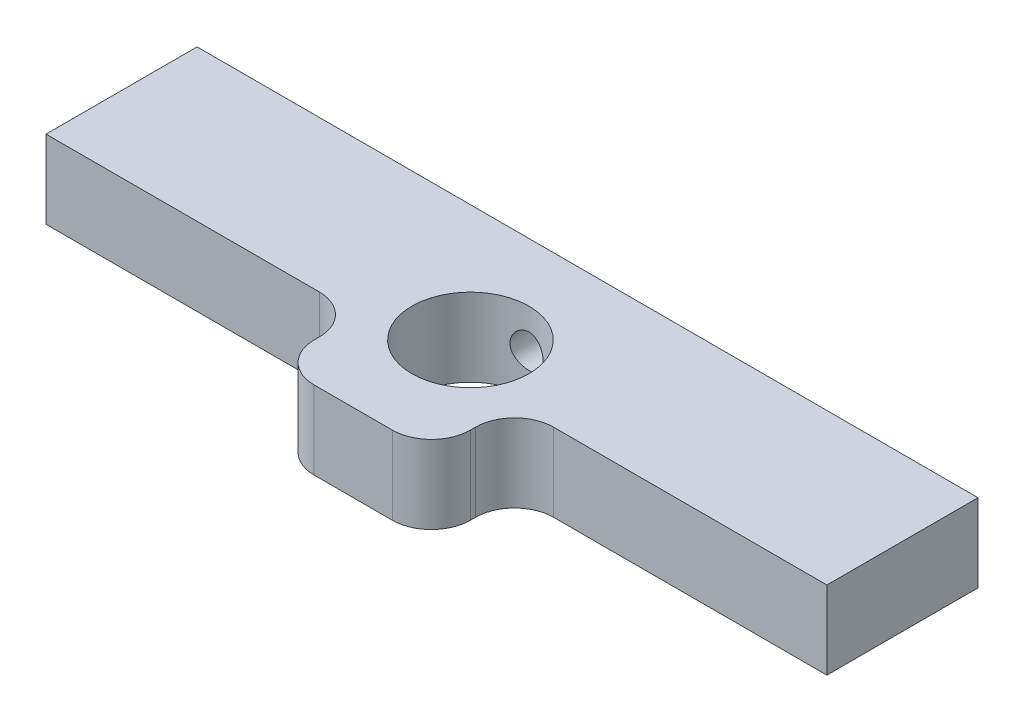
ISO-10303-21;
HEADER;
FILE_DESCRIPTION(('STEP AP214'),'2;1');
FILE_NAME('part.step','',(''),(''),'','','');
FILE_SCHEMA(('AUTOMOTIVE_DESIGN { 1 0 10303 214 1 1 1 1 }'));
ENDSEC;
DATA;
#1=APPLICATION_CONTEXT('core data for automotive mechanical design processes');
#2=APPLICATION_PROTOCOL_DEFINITION('international standard','automotive_design',2000,#1);
#3=PRODUCT_CONTEXT('',#1,'mechanical');
#4=PRODUCT('Part','Part','',(#3));
#5=PRODUCT_RELATED_PRODUCT_CATEGORY('part','',(#4));
#6=PRODUCT_DEFINITION_FORMATION('','',#4);
#7=PRODUCT_DEFINITION_CONTEXT('part definition',#1,'design');
#8=PRODUCT_DEFINITION('design','',#6,#7);
#9=PRODUCT_DEFINITION_SHAPE('','',#8);
#10=(LENGTH_UNIT() NAMED_UNIT(*) SI_UNIT(.MILLI.,.METRE.));
#11=(NAMED_UNIT(*) PLANE_ANGLE_UNIT() SI_UNIT($,.RADIAN.));
#12=(NAMED_UNIT(*) SI_UNIT($,.STERADIAN.) SOLID_ANGLE_UNIT());
#13=UNCERTAINTY_MEASURE_WITH_UNIT(LENGTH_MEASURE(1.E-05),#10,'distance_accuracy_value','');
#14=(GEOMETRIC_REPRESENTATION_CONTEXT(3) GLOBAL_UNCERTAINTY_ASSIGNED_CONTEXT((#13)) GLOBAL_UNIT_ASSIGNED_CONTEXT((#10,
#11,#12)) REPRESENTATION_CONTEXT('',''));
#15=CARTESIAN_POINT('',(0.,0.,0.));
#16=DIRECTION('',(0.,0.,1.));
#17=DIRECTION('',(1.,0.,0.));
#18=AXIS2_PLACEMENT_3D('',#15,#16,#17);
#19=CARTESIAN_POINT('',(0.,6.35,0.));
#20=DIRECTION('',(0.,-1.,0.));
#21=DIRECTION('',(0.,0.,-1.));
#22=AXIS2_PLACEMENT_3D('',#19,#20,#21);
#23=PLANE('',#22);
#24=CARTESIAN_POINT('',(0.,6.35,0.));
#25=DIRECTION('',(0.,1.,0.));
#26=DIRECTION('',(0.,0.,1.));
#27=AXIS2_PLACEMENT_3D('',#24,#25,#26);
#28=CIRCLE('',#27,4.7625);
#29=CARTESIAN_POINT('',(0.,6.35,4.7625));
#30=VERTEX_POINT('',#29);
#31=EDGE_CURVE('E173',#30,#30,#28,.T.);
#32=ORIENTED_EDGE('',*,*,#31,.F.);
#33=EDGE_LOOP('',(#32));
#34=FACE_BOUND('',#33,.T.);
#35=DIRECTION('',(1.,0.,0.));
#36=VECTOR('',#35,1.);
#37=CARTESIAN_POINT('',(-31.75,6.35,9.525));
#38=LINE('',#37,#36);
#39=CARTESIAN_POINT('',(-3.175,6.35,9.525));
#40=VERTEX_POINT('',#39);
#41=CARTESIAN_POINT('',(3.175,6.35,9.525));
#42=VERTEX_POINT('',#41);
#43=EDGE_CURVE('E159',#40,#42,#38,.T.);
#44=ORIENTED_EDGE('',*,*,#43,.T.);
#45=CARTESIAN_POINT('',(3.175,6.35,6.35));
#46=DIRECTION('',(0.,-1.,0.));
#47=DIRECTION('',(0.,0.,-1.));
#48=AXIS2_PLACEMENT_3D('',#45,#46,#47);
#49=CIRCLE('',#48,3.175);
#50=CARTESIAN_POINT('',(6.35,6.35,6.35));
#51=VERTEX_POINT('',#50);
#52=EDGE_CURVE('E208',#42,#51,#49,.F.);
#53=ORIENTED_EDGE('',*,*,#52,.T.);
#54=DIRECTION('',(0.,0.,-1.));
#55=VECTOR('',#54,1.);
#56=CARTESIAN_POINT('',(6.35,6.35,0.));
#57=LINE('',#56,#55);
#58=CARTESIAN_POINT('',(6.35,6.35,5.93727540000001));
#59=VERTEX_POINT('',#58);
#60=EDGE_CURVE('E294',#51,#59,#57,.T.);
#61=ORIENTED_EDGE('',*,*,#60,.T.);
#62=CARTESIAN_POINT('',(9.525,6.35,5.9372754));
#63=DIRECTION('',(0.,-1.,0.));
#64=DIRECTION('',(0.,0.,-1.));
#65=AXIS2_PLACEMENT_3D('',#62,#63,#64);
#66=CIRCLE('',#65,3.175);
#67=CARTESIAN_POINT('',(9.525,6.35,2.7622754));
#68=VERTEX_POINT('',#67);
#69=EDGE_CURVE('E225',#59,#68,#66,.T.);
#70=ORIENTED_EDGE('',*,*,#69,.T.);
#71=DIRECTION('',(-1.,0.,0.));
#72=VECTOR('',#71,1.);
#73=CARTESIAN_POINT('',(0.,6.35,2.76227540000001));
#74=LINE('',#73,#72);
#75=CARTESIAN_POINT('',(31.75,6.35,2.7622754));
#76=VERTEX_POINT('',#75);
#77=EDGE_CURVE('E300',#76,#68,#74,.T.);
#78=ORIENTED_EDGE('',*,*,#77,.F.);
#79=DIRECTION('',(0.,0.,-1.));
#80=VECTOR('',#79,1.);
#81=CARTESIAN_POINT('',(31.75,6.35,9.525));
#82=LINE('',#81,#80);
#83=CARTESIAN_POINT('',(31.75,6.35,-9.525));
#84=VERTEX_POINT('',#83);
#85=EDGE_CURVE('E165',#76,#84,#82,.T.);
#86=ORIENTED_EDGE('',*,*,#85,.T.);
#87=DIRECTION('',(-1.,0.,0.));
#88=VECTOR('',#87,1.);
#89=CARTESIAN_POINT('',(-31.75,6.35,-9.525));
#90=LINE('',#89,#88);
#91=CARTESIAN_POINT('',(-31.75,6.35,-9.525));
#92=VERTEX_POINT('',#91);
#93=EDGE_CURVE('E156',#84,#92,#90,.T.);
#94=ORIENTED_EDGE('',*,*,#93,.T.);
#95=DIRECTION('',(0.,0.,1.));
#96=VECTOR('',#95,1.);
#97=CARTESIAN_POINT('',(-31.75,6.35,9.525));
#98=LINE('',#97,#96);
#99=CARTESIAN_POINT('',(-31.75,6.35,2.76227540000001));
#100=VERTEX_POINT('',#99);
#101=EDGE_CURVE('E148',#92,#100,#98,.T.);
#102=ORIENTED_EDGE('',*,*,#101,.T.);
#103=DIRECTION('',(-1.,0.,0.));
#104=VECTOR('',#103,1.);
#105=CARTESIAN_POINT('',(0.,6.35,2.7622754));
#106=LINE('',#105,#104);
#107=CARTESIAN_POINT('',(-9.525,6.35,2.7622754));
#108=VERTEX_POINT('',#107);
#109=EDGE_CURVE('E132',#108,#100,#106,.T.);
#110=ORIENTED_EDGE('',*,*,#109,.F.);
#111=CARTESIAN_POINT('',(-9.525,6.35,5.93727540000001));
#112=DIRECTION('',(0.,-1.,0.));
#113=DIRECTION('',(0.,0.,-1.));
#114=AXIS2_PLACEMENT_3D('',#111,#112,#113);
#115=CIRCLE('',#114,3.175);
#116=CARTESIAN_POINT('',(-6.35,6.35,5.93727540000001));
#117=VERTEX_POINT('',#116);
#118=EDGE_CURVE('E51',#108,#117,#115,.T.);
#119=ORIENTED_EDGE('',*,*,#118,.T.);
#120=DIRECTION('',(0.,0.,1.));
#121=VECTOR('',#120,1.);
#122=CARTESIAN_POINT('',(-6.35,6.35,0.));
#123=LINE('',#122,#121);
#124=CARTESIAN_POINT('',(-6.35,6.35,6.35));
#125=VERTEX_POINT('',#124);
#126=EDGE_CURVE('E142',#117,#125,#123,.T.);
#127=ORIENTED_EDGE('',*,*,#126,.T.);
#128=CARTESIAN_POINT('',(-3.175,6.35,6.35));
#129=DIRECTION('',(0.,-1.,0.));
#130=DIRECTION('',(0.,0.,-1.));
#131=AXIS2_PLACEMENT_3D('',#128,#129,#130);
#132=CIRCLE('',#131,3.175);
#133=EDGE_CURVE('E205',#125,#40,#132,.F.);
#134=ORIENTED_EDGE('',*,*,#133,.T.);
#135=EDGE_LOOP('',(#44,#53,#61,#70,#78,#86,#94,#102,#110,#119,#127,#134));
#136=FACE_BOUND('',#135,.T.);
#137=ADVANCED_FACE('F42',(#34,#136),#23,.F.);
#138=CARTESIAN_POINT('',(0.,0.,0.));
#139=DIRECTION('',(0.,-1.,0.));
#140=DIRECTION('',(0.,0.,-1.));
#141=AXIS2_PLACEMENT_3D('',#138,#139,#140);
#142=PLANE('',#141);
#143=CARTESIAN_POINT('',(0.,0.,0.));
#144=DIRECTION('',(0.,1.,0.));
#145=DIRECTION('',(0.,0.,1.));
#146=AXIS2_PLACEMENT_3D('',#143,#144,#145);
#147=CIRCLE('',#146,4.7625);
#148=CARTESIAN_POINT('',(0.,0.,4.7625));
#149=VERTEX_POINT('',#148);
#150=EDGE_CURVE('E325',#149,#149,#147,.T.);
#151=ORIENTED_EDGE('',*,*,#150,.T.);
#152=EDGE_LOOP('',(#151));
#153=FACE_BOUND('',#152,.T.);
#154=DIRECTION('',(0.,0.,-1.));
#155=VECTOR('',#154,1.);
#156=CARTESIAN_POINT('',(6.35,0.,0.));
#157=LINE('',#156,#155);
#158=CARTESIAN_POINT('',(6.35,0.,6.35));
#159=VERTEX_POINT('',#158);
#160=CARTESIAN_POINT('',(6.35,0.,5.93727540000001));
#161=VERTEX_POINT('',#160);
#162=EDGE_CURVE('E289',#159,#161,#157,.T.);
#163=ORIENTED_EDGE('',*,*,#162,.F.);
#164=CARTESIAN_POINT('',(3.175,0.,6.35));
#165=DIRECTION('',(0.,-1.,0.));
#166=DIRECTION('',(0.,0.,-1.));
#167=AXIS2_PLACEMENT_3D('',#164,#165,#166);
#168=CIRCLE('',#167,3.175);
#169=CARTESIAN_POINT('',(3.175,0.,9.525));
#170=VERTEX_POINT('',#169);
#171=EDGE_CURVE('E213',#159,#170,#168,.T.);
#172=ORIENTED_EDGE('',*,*,#171,.T.);
#173=DIRECTION('',(1.,0.,0.));
#174=VECTOR('',#173,1.);
#175=CARTESIAN_POINT('',(-31.75,0.,9.525));
#176=LINE('',#175,#174);
#177=CARTESIAN_POINT('',(-3.175,0.,9.525));
#178=VERTEX_POINT('',#177);
#179=EDGE_CURVE('E178',#178,#170,#176,.T.);
#180=ORIENTED_EDGE('',*,*,#179,.F.);
#181=CARTESIAN_POINT('',(-3.175,0.,6.35));
#182=DIRECTION('',(0.,-1.,0.));
#183=DIRECTION('',(0.,0.,-1.));
#184=AXIS2_PLACEMENT_3D('',#181,#182,#183);
#185=CIRCLE('',#184,3.175);
#186=CARTESIAN_POINT('',(-6.35,0.,6.35));
#187=VERTEX_POINT('',#186);
#188=EDGE_CURVE('E62',#178,#187,#185,.T.);
#189=ORIENTED_EDGE('',*,*,#188,.T.);
#190=DIRECTION('',(0.,0.,1.));
#191=VECTOR('',#190,1.);
#192=CARTESIAN_POINT('',(-6.35,0.,0.));
#193=LINE('',#192,#191);
#194=CARTESIAN_POINT('',(-6.35,0.,5.93727540000001));
#195=VERTEX_POINT('',#194);
#196=EDGE_CURVE('E239',#195,#187,#193,.T.);
#197=ORIENTED_EDGE('',*,*,#196,.F.);
#198=CARTESIAN_POINT('',(-9.525,0.,5.93727540000001));
#199=DIRECTION('',(0.,-1.,0.));
#200=DIRECTION('',(0.,0.,-1.));
#201=AXIS2_PLACEMENT_3D('',#198,#199,#200);
#202=CIRCLE('',#201,3.175);
#203=CARTESIAN_POINT('',(-9.525,0.,2.7622754));
#204=VERTEX_POINT('',#203);
#205=EDGE_CURVE('E11',#195,#204,#202,.F.);
#206=ORIENTED_EDGE('',*,*,#205,.T.);
#207=DIRECTION('',(-1.,0.,0.));
#208=VECTOR('',#207,1.);
#209=CARTESIAN_POINT('',(0.,0.,2.7622754));
#210=LINE('',#209,#208);
#211=CARTESIAN_POINT('',(-31.75,0.,2.76227540000001));
#212=VERTEX_POINT('',#211);
#213=EDGE_CURVE('E152',#204,#212,#210,.T.);
#214=ORIENTED_EDGE('',*,*,#213,.T.);
#215=DIRECTION('',(0.,0.,1.));
#216=VECTOR('',#215,1.);
#217=CARTESIAN_POINT('',(-31.75,0.,9.525));
#218=LINE('',#217,#216);
#219=CARTESIAN_POINT('',(-31.75,0.,-9.525));
#220=VERTEX_POINT('',#219);
#221=EDGE_CURVE('E150',#220,#212,#218,.T.);
#222=ORIENTED_EDGE('',*,*,#221,.F.);
#223=DIRECTION('',(-1.,0.,0.));
#224=VECTOR('',#223,1.);
#225=CARTESIAN_POINT('',(-31.75,0.,-9.525));
#226=LINE('',#225,#224);
#227=CARTESIAN_POINT('',(31.75,0.,-9.525));
#228=VERTEX_POINT('',#227);
#229=EDGE_CURVE('E172',#228,#220,#226,.T.);
#230=ORIENTED_EDGE('',*,*,#229,.F.);
#231=DIRECTION('',(0.,0.,-1.));
#232=VECTOR('',#231,1.);
#233=CARTESIAN_POINT('',(31.75,0.,9.525));
#234=LINE('',#233,#232);
#235=CARTESIAN_POINT('',(31.75,0.,2.7622754));
#236=VERTEX_POINT('',#235);
#237=EDGE_CURVE('E169',#236,#228,#234,.T.);
#238=ORIENTED_EDGE('',*,*,#237,.F.);
#239=DIRECTION('',(-1.,0.,0.));
#240=VECTOR('',#239,1.);
#241=CARTESIAN_POINT('',(0.,0.,2.76227540000001));
#242=LINE('',#241,#240);
#243=CARTESIAN_POINT('',(9.525,0.,2.7622754));
#244=VERTEX_POINT('',#243);
#245=EDGE_CURVE('E304',#236,#244,#242,.T.);
#246=ORIENTED_EDGE('',*,*,#245,.T.);
#247=CARTESIAN_POINT('',(9.525,0.,5.9372754));
#248=DIRECTION('',(0.,-1.,0.));
#249=DIRECTION('',(0.,0.,-1.));
#250=AXIS2_PLACEMENT_3D('',#247,#248,#249);
#251=CIRCLE('',#250,3.175);
#252=EDGE_CURVE('E228',#244,#161,#251,.F.);
#253=ORIENTED_EDGE('',*,*,#252,.T.);
#254=EDGE_LOOP('',(#163,#172,#180,#189,#197,#206,#214,#222,#230,#238,#246,#253));
#255=FACE_BOUND('',#254,.T.);
#256=ADVANCED_FACE('F249',(#153,#255),#142,.T.);
#257=CARTESIAN_POINT('',(-31.75,6.35,9.525));
#258=DIRECTION('',(0.,0.,-1.));
#259=DIRECTION('',(-1.,0.,0.));
#260=AXIS2_PLACEMENT_3D('',#257,#258,#259);
#261=PLANE('',#260);
#262=ORIENTED_EDGE('',*,*,#179,.T.);
#263=DIRECTION('',(0.,1.,0.));
#264=VECTOR('',#263,1.);
#265=CARTESIAN_POINT('',(3.175,6.35,9.525));
#266=LINE('',#265,#264);
#267=EDGE_CURVE('E201',#170,#42,#266,.T.);
#268=ORIENTED_EDGE('',*,*,#267,.T.);
#269=ORIENTED_EDGE('',*,*,#43,.F.);
#270=DIRECTION('',(0.,1.,0.));
#271=VECTOR('',#270,1.);
#272=CARTESIAN_POINT('',(-3.175,0.,9.525));
#273=LINE('',#272,#271);
#274=EDGE_CURVE('E198',#40,#178,#273,.F.);
#275=ORIENTED_EDGE('',*,*,#274,.T.);
#276=EDGE_LOOP('',(#262,#268,#269,#275));
#277=FACE_BOUND('',#276,.T.);
#278=ADVANCED_FACE('F256',(#277),#261,.F.);
#279=CARTESIAN_POINT('',(31.75,6.35,9.525));
#280=DIRECTION('',(-1.,0.,0.));
#281=DIRECTION('',(0.,0.,1.));
#282=AXIS2_PLACEMENT_3D('',#279,#280,#281);
#283=PLANE('',#282);
#284=ORIENTED_EDGE('',*,*,#85,.F.);
#285=DIRECTION('',(0.,1.,0.));
#286=VECTOR('',#285,1.);
#287=CARTESIAN_POINT('',(31.75,-0.00100000000000013,2.7622754));
#288=LINE('',#287,#286);
#289=EDGE_CURVE('E299',#236,#76,#288,.T.);
#290=ORIENTED_EDGE('',*,*,#289,.F.);
#291=ORIENTED_EDGE('',*,*,#237,.T.);
#292=DIRECTION('',(0.,-1.,0.));
#293=VECTOR('',#292,1.);
#294=CARTESIAN_POINT('',(31.75,6.35,-9.525));
#295=LINE('',#294,#293);
#296=EDGE_CURVE('E184',#84,#228,#295,.T.);
#297=ORIENTED_EDGE('',*,*,#296,.F.);
#298=EDGE_LOOP('',(#284,#290,#291,#297));
#299=FACE_BOUND('',#298,.T.);
#300=ADVANCED_FACE('F266',(#299),#283,.F.);
#301=CARTESIAN_POINT('',(-31.75,6.35,-9.525));
#302=DIRECTION('',(0.,0.,1.));
#303=DIRECTION('',(1.,0.,0.));
#304=AXIS2_PLACEMENT_3D('',#301,#302,#303);
#305=PLANE('',#304);
#306=CARTESIAN_POINT('',(0.,3.175,-9.525));
#307=DIRECTION('',(0.,0.,-1.));
#308=DIRECTION('',(-1.,0.,0.));
#309=AXIS2_PLACEMENT_3D('',#306,#307,#308);
#310=CIRCLE('',#309,1.35254999999999);
#311=CARTESIAN_POINT('',(-1.35254999999999,3.175,-9.525));
#312=VERTEX_POINT('',#311);
#313=EDGE_CURVE('E313',#312,#312,#310,.T.);
#314=ORIENTED_EDGE('',*,*,#313,.F.);
#315=EDGE_LOOP('',(#314));
#316=FACE_BOUND('',#315,.T.);
#317=ORIENTED_EDGE('',*,*,#229,.T.);
#318=DIRECTION('',(0.,-1.,0.));
#319=VECTOR('',#318,1.);
#320=CARTESIAN_POINT('',(-31.75,6.35,-9.525));
#321=LINE('',#320,#319);
#322=EDGE_CURVE('E163',#92,#220,#321,.T.);
#323=ORIENTED_EDGE('',*,*,#322,.F.);
#324=ORIENTED_EDGE('',*,*,#93,.F.);
#325=ORIENTED_EDGE('',*,*,#296,.T.);
#326=EDGE_LOOP('',(#317,#323,#324,#325));
#327=FACE_BOUND('',#326,.T.);
#328=ADVANCED_FACE('F269',(#316,#327),#305,.F.);
#329=CARTESIAN_POINT('',(-31.75,6.35,9.525));
#330=DIRECTION('',(1.,0.,0.));
#331=DIRECTION('',(0.,0.,-1.));
#332=AXIS2_PLACEMENT_3D('',#329,#330,#331);
#333=PLANE('',#332);
#334=ORIENTED_EDGE('',*,*,#221,.T.);
#335=DIRECTION('',(0.,1.,0.));
#336=VECTOR('',#335,1.);
#337=CARTESIAN_POINT('',(-31.75,-0.00100000000000013,2.76227540000001));
#338=LINE('',#337,#336);
#339=EDGE_CURVE('E135',#212,#100,#338,.T.);
#340=ORIENTED_EDGE('',*,*,#339,.T.);
#341=ORIENTED_EDGE('',*,*,#101,.F.);
#342=ORIENTED_EDGE('',*,*,#322,.T.);
#343=EDGE_LOOP('',(#334,#340,#341,#342));
#344=FACE_BOUND('',#343,.T.);
#345=ADVANCED_FACE('F146',(#344),#333,.F.);
#346=CARTESIAN_POINT('',(0.,6.35,0.));
#347=DIRECTION('',(0.,-1.,0.));
#348=DIRECTION('',(0.,0.,-1.));
#349=AXIS2_PLACEMENT_3D('',#346,#347,#348);
#350=CYLINDRICAL_SURFACE('',#349,4.7625);
#351=CARTESIAN_POINT('',(0.,4.52754999999999,-4.7625));
#352=CARTESIAN_POINT('',(-0.074378499958147,4.5275486430201,-4.7624990905622));
#353=CARTESIAN_POINT('',(-0.148770997363665,4.52139427786597,-4.76074068414839));
#354=CARTESIAN_POINT('',(-0.295401048443409,4.4969904782931,-4.75389731213497));
#355=CARTESIAN_POINT('',(-0.367637754898102,4.47873635244936,-4.74881105624237));
#356=CARTESIAN_POINT('',(-0.507819372462199,4.43078329715905,-4.73587132206403));
#357=CARTESIAN_POINT('',(-0.575770075173445,4.40110021454008,-4.72802167664354));
#358=CARTESIAN_POINT('',(-0.705729564095675,4.33119378181306,-4.710377746781));
#359=CARTESIAN_POINT('',(-0.767737748085326,4.29096936497404,-4.70058326555549));
#360=CARTESIAN_POINT('',(-0.885664511249002,4.20001870977712,-4.67981587709255));
#361=CARTESIAN_POINT('',(-0.94140661473993,4.14906872941422,-4.66882075569231));
#362=CARTESIAN_POINT('',(-1.04368118906314,4.03859076612216,-4.64702871784162));
#363=CARTESIAN_POINT('',(-1.09021229789723,3.97906151685142,-4.63623183091725));
#364=CARTESIAN_POINT('',(-1.17363874376927,3.85166351744423,-4.61582763733191));
#365=CARTESIAN_POINT('',(-1.21032481599622,3.78365286087308,-4.60624815020734));
#366=CARTESIAN_POINT('',(-1.27166948775741,3.64211211694877,-4.58969276319239));
#367=CARTESIAN_POINT('',(-1.29633063998999,3.56858320486075,-4.58271631079326));
#368=CARTESIAN_POINT('',(-1.3323006220351,3.42006189795207,-4.57238733366614));
#369=CARTESIAN_POINT('',(-1.34393220362154,3.34515390446938,-4.56894739365361));
#370=CARTESIAN_POINT('',(-1.35451996418055,3.1943768560357,-4.56582030437458));
#371=CARTESIAN_POINT('',(-1.35347886096571,3.11850801063768,-4.5661323504485));
#372=CARTESIAN_POINT('',(-1.33900564806271,2.97053442802031,-4.57039612187765));
#373=CARTESIAN_POINT('',(-1.32597092922696,2.89838691263082,-4.57423111302579));
#374=CARTESIAN_POINT('',(-1.28851978726117,2.75734778962324,-4.58492077482652));
#375=CARTESIAN_POINT('',(-1.2641023462199,2.688456473801,-4.59177571553807));
#376=CARTESIAN_POINT('',(-1.20427101589374,2.55488196332035,-4.60783068706061));
#377=CARTESIAN_POINT('',(-1.16872313756865,2.49026233362383,-4.61705903338387));
#378=CARTESIAN_POINT('',(-1.08773328002494,2.36776901838412,-4.63680661480737));
#379=CARTESIAN_POINT('',(-1.04228912138712,2.30989682311937,-4.64732613403455));
#380=CARTESIAN_POINT('',(-0.940794256967899,2.20027881637208,-4.66895040089115));
#381=CARTESIAN_POINT('',(-0.884411776618566,2.14884113440109,-4.68006235899327));
#382=CARTESIAN_POINT('',(-0.763683506834267,2.056083587976,-4.701270538666));
#383=CARTESIAN_POINT('',(-0.699337314715694,2.01476423546828,-4.71136670882664));
#384=CARTESIAN_POINT('',(-0.563989221375797,1.94325494809201,-4.72948235962791));
#385=CARTESIAN_POINT('',(-0.492952838256659,1.91312712835502,-4.73749017851947));
#386=CARTESIAN_POINT('',(-0.346542575324877,1.86533374841148,-4.75044281323286));
#387=CARTESIAN_POINT('',(-0.271169780302286,1.84766508597671,-4.75538839149013));
#388=CARTESIAN_POINT('',(-0.120850696904537,1.82579009417371,-4.76154131476188));
#389=CARTESIAN_POINT('',(-0.0459699308037998,1.82116553193466,-4.76286475366233));
#390=CARTESIAN_POINT('',(0.103499566400341,1.82434628148553,-4.76196150939729));
#391=CARTESIAN_POINT('',(0.178088331040755,1.8321501211997,-4.75973524667437));
#392=CARTESIAN_POINT('',(0.323320333171316,1.85962538244712,-4.75205828854764));
#393=CARTESIAN_POINT('',(0.394012520550826,1.8790578995256,-4.74667254553646));
#394=CARTESIAN_POINT('',(0.531122495891907,1.92895641763358,-4.73329318241284));
#395=CARTESIAN_POINT('',(0.597539791066199,1.95942368801874,-4.72529926228568));
#396=CARTESIAN_POINT('',(0.725796270146897,2.03126494247287,-4.70732543764485));
#397=CARTESIAN_POINT('',(0.787506578464483,2.07285900781803,-4.6973065860586));
#398=CARTESIAN_POINT('',(0.903216277264464,2.16550128896997,-4.67643766201817));
#399=CARTESIAN_POINT('',(0.957213930011422,2.21655162943406,-4.66558740308336));
#400=CARTESIAN_POINT('',(1.05776890968239,2.32861713337727,-4.64384180185687));
#401=CARTESIAN_POINT('',(1.1040297010466,2.38990082578654,-4.6329563160084));
#402=CARTESIAN_POINT('',(1.18562443626754,2.51959581025902,-4.61275127903121));
#403=CARTESIAN_POINT('',(1.22095876925181,2.58800684837769,-4.60343167214173));
#404=CARTESIAN_POINT('',(1.27943864976602,2.72972431512764,-4.58752245180626));
#405=CARTESIAN_POINT('',(1.3026495237019,2.80300205720859,-4.58091824850396));
#406=CARTESIAN_POINT('',(1.33634832071343,2.95264418491539,-4.5712025660945));
#407=CARTESIAN_POINT('',(1.34684004147843,3.02900764216698,-4.5680900444605));
#408=CARTESIAN_POINT('',(1.3545634936903,3.17959566461426,-4.56580529583762));
#409=CARTESIAN_POINT('',(1.35227511990276,3.25379379693445,-4.56649045772405));
#410=CARTESIAN_POINT('',(1.33563291667447,3.40069987613526,-4.57138541209335));
#411=CARTESIAN_POINT('',(1.32127948086556,3.47340787155346,-4.57559508958619));
#412=CARTESIAN_POINT('',(1.28120938194407,3.61457466494029,-4.58697424833289));
#413=CARTESIAN_POINT('',(1.25560725829135,3.68306855721659,-4.5941138485776));
#414=CARTESIAN_POINT('',(1.19385511761934,3.81484262392982,-4.61054579052911));
#415=CARTESIAN_POINT('',(1.157703252534,3.87812188239307,-4.61983850935274));
#416=CARTESIAN_POINT('',(1.07447772612257,3.9999291052839,-4.63991281967711));
#417=CARTESIAN_POINT('',(1.02708281091476,4.05823115248443,-4.65073344512606));
#418=CARTESIAN_POINT('',(0.923310873670467,4.16621022719649,-4.67244141501305));
#419=CARTESIAN_POINT('',(0.866931600829678,4.21588508684919,-4.68332877551092));
#420=CARTESIAN_POINT('',(0.745075103274013,4.30644175885674,-4.70427270151549));
#421=CARTESIAN_POINT('',(0.679404116686305,4.34706990505124,-4.71430135163212));
#422=CARTESIAN_POINT('',(0.541879248534657,4.41664775838159,-4.73207848194561));
#423=CARTESIAN_POINT('',(0.470028828292717,4.44560395236432,-4.73982822802492));
#424=CARTESIAN_POINT('',(0.33218245338348,4.48782989682263,-4.751335030315));
#425=CARTESIAN_POINT('',(0.266702044494605,4.50268750874605,-4.75548935771175));
#426=CARTESIAN_POINT('',(0.134151413500936,4.52254753056348,-4.76107207516972));
#427=CARTESIAN_POINT('',(0.0670813995808872,4.52755122384977,-4.76250082021498));
#428=CARTESIAN_POINT('',(0.,4.52754999999999,-4.7625));
#429=B_SPLINE_CURVE_WITH_KNOTS('',3,(#351,#352,#353,#354,#355,#356,#357,#358,#359,#360,#361,
#362,#363,#364,#365,#366,#367,#368,#369,#370,#371,#372,#373,#374,#375,#376,#377,#378,#379,#380,
#381,#382,#383,#384,#385,#386,#387,#388,#389,#390,#391,#392,#393,#394,#395,#396,#397,#398,#399,
#400,#401,#402,#403,#404,#405,#406,#407,#408,#409,#410,#411,#412,#413,#414,#415,#416,#417,#418,
#419,#420,#421,#422,#423,#424,#425,#426,#427,#428),.UNSPECIFIED.,.T.,.F.,(4,2,2,2,2,2,2,2,2,2,2,
2,2,2,2,2,2,2,2,2,2,2,2,2,2,2,2,2,2,2,2,2,2,2,2,2,2,2,4),(0.,0.222889294304381,
0.445865059785242,0.668532764991207,0.891223011776165,1.11912484754546,1.34706035724664,
1.57951364577629,1.81191756668118,2.03842777803385,2.2648894123513,2.48410768184065,
2.7033455589031,2.92533126990745,3.1473659174872,3.37766327978338,3.60797229178429,
3.83954111207456,4.07105225324435,4.29505113405516,4.51902348540566,4.7385452391527,
4.95809225306817,5.18235198880405,5.40666217297805,5.63821506829866,5.86975971630007,
6.10004348477562,6.33025847809249,6.55188840440893,6.77351110016062,6.99292761660173,
7.21238259274191,7.43908482813343,7.66584394760142,7.8983281507256,8.13068296884125,
8.33173130329808,8.53275345112235),.UNSPECIFIED.);
#430=CARTESIAN_POINT('',(0.,4.52754999999999,-4.7625));
#431=VERTEX_POINT('',#430);
#432=EDGE_CURVE('E317',#431,#431,#429,.T.);
#433=ORIENTED_EDGE('',*,*,#432,.F.);
#434=EDGE_LOOP('',(#433));
#435=FACE_BOUND('',#434,.T.);
#436=ORIENTED_EDGE('',*,*,#31,.T.);
#437=EDGE_LOOP('',(#436));
#438=FACE_BOUND('',#437,.T.);
#439=ORIENTED_EDGE('',*,*,#150,.F.);
#440=EDGE_LOOP('',(#439));
#441=FACE_BOUND('',#440,.T.);
#442=ADVANCED_FACE('F261',(#435,#438,#441),#350,.F.);
#443=CARTESIAN_POINT('',(0.,3.175,-9.525));
#444=DIRECTION('',(0.,0.,-1.));
#445=DIRECTION('',(-1.,0.,0.));
#446=AXIS2_PLACEMENT_3D('',#443,#444,#445);
#447=CYLINDRICAL_SURFACE('',#446,1.35254999999999);
#448=ORIENTED_EDGE('',*,*,#313,.T.);
#449=EDGE_LOOP('',(#448));
#450=FACE_BOUND('',#449,.T.);
#451=ORIENTED_EDGE('',*,*,#432,.T.);
#452=EDGE_LOOP('',(#451));
#453=FACE_BOUND('',#452,.T.);
#454=ADVANCED_FACE('F328',(#450,#453),#447,.F.);
#455=CARTESIAN_POINT('',(6.35,-0.00100000000000013,0.));
#456=DIRECTION('',(1.,0.,0.));
#457=DIRECTION('',(0.,0.,-1.));
#458=AXIS2_PLACEMENT_3D('',#455,#456,#457);
#459=PLANE('',#458);
#460=ORIENTED_EDGE('',*,*,#162,.T.);
#461=DIRECTION('',(0.,1.,0.));
#462=VECTOR('',#461,1.);
#463=CARTESIAN_POINT('',(6.35,-0.00100000000000013,5.93727540000001));
#464=LINE('',#463,#462);
#465=EDGE_CURVE('E191',#161,#59,#464,.T.);
#466=ORIENTED_EDGE('',*,*,#465,.T.);
#467=ORIENTED_EDGE('',*,*,#60,.F.);
#468=DIRECTION('',(0.,1.,0.));
#469=VECTOR('',#468,1.);
#470=CARTESIAN_POINT('',(6.35,0.,6.35));
#471=LINE('',#470,#469);
#472=EDGE_CURVE('E188',#51,#159,#471,.F.);
#473=ORIENTED_EDGE('',*,*,#472,.T.);
#474=EDGE_LOOP('',(#460,#466,#467,#473));
#475=FACE_BOUND('',#474,.T.);
#476=ADVANCED_FACE('F296',(#475),#459,.T.);
#477=CARTESIAN_POINT('',(0.,-0.00100000000000013,2.76227540000001));
#478=DIRECTION('',(0.,0.,-1.));
#479=DIRECTION('',(-1.,0.,0.));
#480=AXIS2_PLACEMENT_3D('',#477,#478,#479);
#481=PLANE('',#480);
#482=ORIENTED_EDGE('',*,*,#77,.T.);
#483=DIRECTION('',(0.,1.,0.));
#484=VECTOR('',#483,1.);
#485=CARTESIAN_POINT('',(9.525,-0.00100000000000013,2.7622754));
#486=LINE('',#485,#484);
#487=EDGE_CURVE('E195',#68,#244,#486,.F.);
#488=ORIENTED_EDGE('',*,*,#487,.T.);
#489=ORIENTED_EDGE('',*,*,#245,.F.);
#490=ORIENTED_EDGE('',*,*,#289,.T.);
#491=EDGE_LOOP('',(#482,#488,#489,#490));
#492=FACE_BOUND('',#491,.T.);
#493=ADVANCED_FACE('F333',(#492),#481,.F.);
#494=CARTESIAN_POINT('',(-6.35,-0.00100000000000013,0.));
#495=DIRECTION('',(-1.,0.,0.));
#496=DIRECTION('',(0.,0.,1.));
#497=AXIS2_PLACEMENT_3D('',#494,#495,#496);
#498=PLANE('',#497);
#499=ORIENTED_EDGE('',*,*,#196,.T.);
#500=DIRECTION('',(0.,1.,0.));
#501=VECTOR('',#500,1.);
#502=CARTESIAN_POINT('',(-6.35,6.35,6.35));
#503=LINE('',#502,#501);
#504=EDGE_CURVE('E219',#187,#125,#503,.T.);
#505=ORIENTED_EDGE('',*,*,#504,.T.);
#506=ORIENTED_EDGE('',*,*,#126,.F.);
#507=DIRECTION('',(0.,1.,0.));
#508=VECTOR('',#507,1.);
#509=CARTESIAN_POINT('',(-6.35,-0.00100000000000013,5.93727540000001));
#510=LINE('',#509,#508);
#511=EDGE_CURVE('E216',#117,#195,#510,.F.);
#512=ORIENTED_EDGE('',*,*,#511,.T.);
#513=EDGE_LOOP('',(#499,#505,#506,#512));
#514=FACE_BOUND('',#513,.T.);
#515=ADVANCED_FACE('F236',(#514),#498,.T.);
#516=CARTESIAN_POINT('',(0.,-0.00100000000000013,2.7622754));
#517=DIRECTION('',(0.,0.,-1.));
#518=DIRECTION('',(-1.,0.,0.));
#519=AXIS2_PLACEMENT_3D('',#516,#517,#518);
#520=PLANE('',#519);
#521=ORIENTED_EDGE('',*,*,#213,.F.);
#522=DIRECTION('',(0.,1.,0.));
#523=VECTOR('',#522,1.);
#524=CARTESIAN_POINT('',(-9.525,-0.00100000000000013,2.7622754));
#525=LINE('',#524,#523);
#526=EDGE_CURVE('E138',#204,#108,#525,.T.);
#527=ORIENTED_EDGE('',*,*,#526,.T.);
#528=ORIENTED_EDGE('',*,*,#109,.T.);
#529=ORIENTED_EDGE('',*,*,#339,.F.);
#530=EDGE_LOOP('',(#521,#527,#528,#529));
#531=FACE_BOUND('',#530,.T.);
#532=ADVANCED_FACE('F134',(#531),#520,.F.);
#533=CARTESIAN_POINT('',(9.525,-0.00100000000000013,5.9372754));
#534=DIRECTION('',(0.,1.,0.));
#535=DIRECTION('',(0.,0.,1.));
#536=AXIS2_PLACEMENT_3D('',#533,#534,#535);
#537=CYLINDRICAL_SURFACE('',#536,3.175);
#538=ORIENTED_EDGE('',*,*,#252,.F.);
#539=ORIENTED_EDGE('',*,*,#487,.F.);
#540=ORIENTED_EDGE('',*,*,#69,.F.);
#541=ORIENTED_EDGE('',*,*,#465,.F.);
#542=EDGE_LOOP('',(#538,#539,#540,#541));
#543=FACE_BOUND('',#542,.T.);
#544=ADVANCED_FACE('F276',(#543),#537,.F.);
#545=CARTESIAN_POINT('',(3.175,6.35,6.35));
#546=DIRECTION('',(0.,-1.,0.));
#547=DIRECTION('',(0.,0.,-1.));
#548=AXIS2_PLACEMENT_3D('',#545,#546,#547);
#549=CYLINDRICAL_SURFACE('',#548,3.175);
#550=ORIENTED_EDGE('',*,*,#171,.F.);
#551=ORIENTED_EDGE('',*,*,#472,.F.);
#552=ORIENTED_EDGE('',*,*,#52,.F.);
#553=ORIENTED_EDGE('',*,*,#267,.F.);
#554=EDGE_LOOP('',(#550,#551,#552,#553));
#555=FACE_BOUND('',#554,.T.);
#556=ADVANCED_FACE('F246',(#555),#549,.T.);
#557=CARTESIAN_POINT('',(-3.175,-0.00100000000000013,6.35));
#558=DIRECTION('',(0.,-1.,0.));
#559=DIRECTION('',(0.,0.,-1.));
#560=AXIS2_PLACEMENT_3D('',#557,#558,#559);
#561=CYLINDRICAL_SURFACE('',#560,3.175);
#562=ORIENTED_EDGE('',*,*,#188,.F.);
#563=ORIENTED_EDGE('',*,*,#274,.F.);
#564=ORIENTED_EDGE('',*,*,#133,.F.);
#565=ORIENTED_EDGE('',*,*,#504,.F.);
#566=EDGE_LOOP('',(#562,#563,#564,#565));
#567=FACE_BOUND('',#566,.T.);
#568=ADVANCED_FACE('F242',(#567),#561,.T.);
#569=CARTESIAN_POINT('',(-9.525,-0.00100000000000013,5.93727540000001));
#570=DIRECTION('',(0.,1.,0.));
#571=DIRECTION('',(0.,0.,1.));
#572=AXIS2_PLACEMENT_3D('',#569,#570,#571);
#573=CYLINDRICAL_SURFACE('',#572,3.175);
#574=ORIENTED_EDGE('',*,*,#205,.F.);
#575=ORIENTED_EDGE('',*,*,#511,.F.);
#576=ORIENTED_EDGE('',*,*,#118,.F.);
#577=ORIENTED_EDGE('',*,*,#526,.F.);
#578=EDGE_LOOP('',(#574,#575,#576,#577));
#579=FACE_BOUND('',#578,.T.);
#580=ADVANCED_FACE('F44',(#579),#573,.F.);
#581=CLOSED_SHELL('',(#137,#256,#278,#300,#328,#345,#442,#454,#476,#493,#515,#532,#544,#556,
#568,#580));
#582=MANIFOLD_SOLID_BREP('B2',#581);
#583=ADVANCED_BREP_SHAPE_REPRESENTATION('',(#18,#582),#14);
#584=SHAPE_DEFINITION_REPRESENTATION(#9,#583);
ENDSEC;
END-ISO-10303-21;
